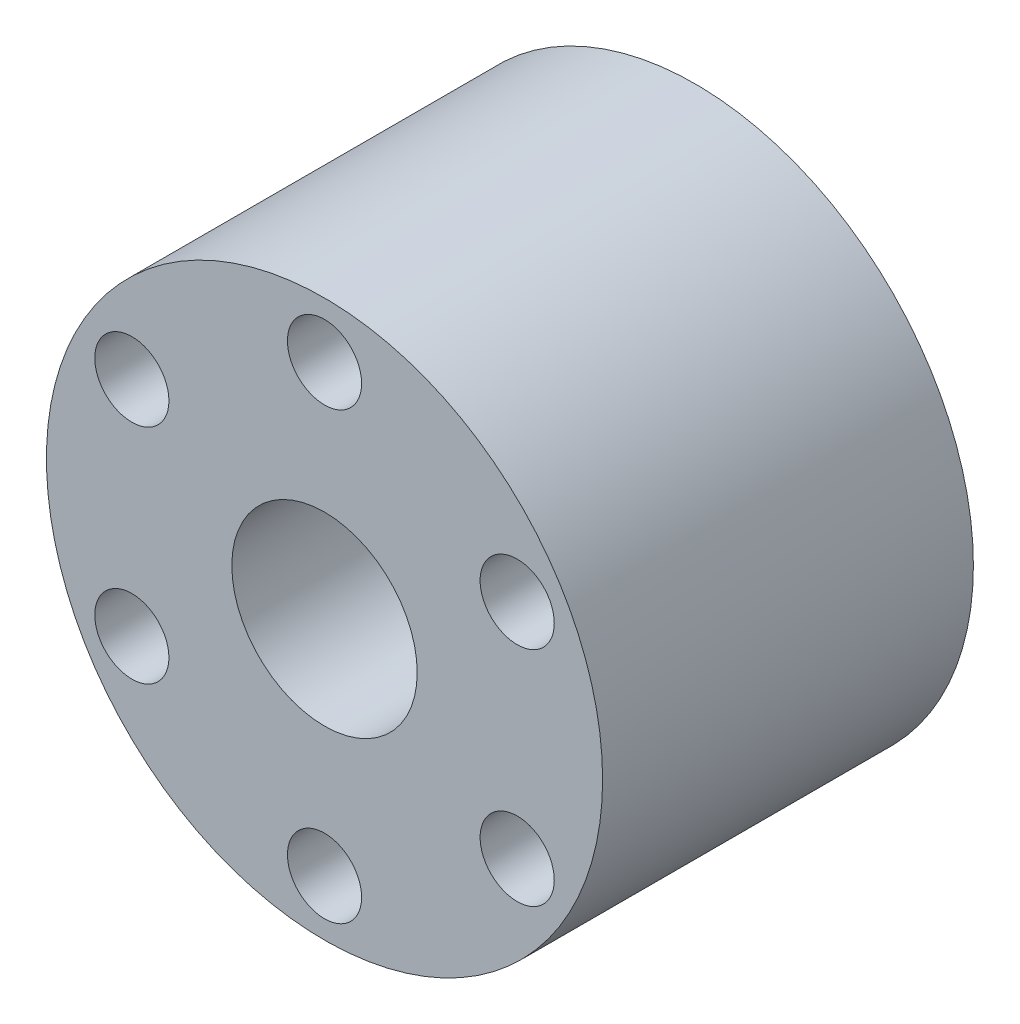
ISO-10303-21;
HEADER;
FILE_DESCRIPTION(('STEP AP214'),'2;1');
FILE_NAME('part.step','',(''),(''),'','','');
FILE_SCHEMA(('AUTOMOTIVE_DESIGN { 1 0 10303 214 1 1 1 1 }'));
ENDSEC;
DATA;
#1=APPLICATION_CONTEXT('core data for automotive mechanical design processes');
#2=APPLICATION_PROTOCOL_DEFINITION('international standard','automotive_design',2000,#1);
#3=PRODUCT_CONTEXT('',#1,'mechanical');
#4=PRODUCT('Part','Part','',(#3));
#5=PRODUCT_RELATED_PRODUCT_CATEGORY('part','',(#4));
#6=PRODUCT_DEFINITION_FORMATION('','',#4);
#7=PRODUCT_DEFINITION_CONTEXT('part definition',#1,'design');
#8=PRODUCT_DEFINITION('design','',#6,#7);
#9=PRODUCT_DEFINITION_SHAPE('','',#8);
#10=(LENGTH_UNIT() NAMED_UNIT(*) SI_UNIT(.MILLI.,.METRE.));
#11=(NAMED_UNIT(*) PLANE_ANGLE_UNIT() SI_UNIT($,.RADIAN.));
#12=(NAMED_UNIT(*) SI_UNIT($,.STERADIAN.) SOLID_ANGLE_UNIT());
#13=UNCERTAINTY_MEASURE_WITH_UNIT(LENGTH_MEASURE(1.E-05),#10,'distance_accuracy_value','');
#14=(GEOMETRIC_REPRESENTATION_CONTEXT(3) GLOBAL_UNCERTAINTY_ASSIGNED_CONTEXT((#13)) GLOBAL_UNIT_ASSIGNED_CONTEXT((#10,
#11,#12)) REPRESENTATION_CONTEXT('',''));
#15=CARTESIAN_POINT('',(0.,0.,0.));
#16=DIRECTION('',(0.,0.,1.));
#17=DIRECTION('',(1.,0.,0.));
#18=AXIS2_PLACEMENT_3D('',#15,#16,#17);
#19=CARTESIAN_POINT('',(0.,0.,20.));
#20=DIRECTION('',(0.,0.,-1.));
#21=DIRECTION('',(-1.,0.,0.));
#22=AXIS2_PLACEMENT_3D('',#19,#20,#21);
#23=CYLINDRICAL_SURFACE('',#22,15.);
#24=CARTESIAN_POINT('',(0.,0.,20.));
#25=DIRECTION('',(0.,0.,1.));
#26=DIRECTION('',(1.,0.,0.));
#27=AXIS2_PLACEMENT_3D('',#24,#25,#26);
#28=CIRCLE('',#27,15.);
#29=CARTESIAN_POINT('',(15.,0.,20.));
#30=VERTEX_POINT('',#29);
#31=EDGE_CURVE('E10',#30,#30,#28,.T.);
#32=ORIENTED_EDGE('',*,*,#31,.F.);
#33=EDGE_LOOP('',(#32));
#34=FACE_BOUND('',#33,.T.);
#35=CARTESIAN_POINT('',(0.,0.,0.));
#36=DIRECTION('',(0.,0.,1.));
#37=DIRECTION('',(1.,0.,0.));
#38=AXIS2_PLACEMENT_3D('',#35,#36,#37);
#39=CIRCLE('',#38,15.);
#40=CARTESIAN_POINT('',(15.,0.,0.));
#41=VERTEX_POINT('',#40);
#42=EDGE_CURVE('E35',#41,#41,#39,.T.);
#43=ORIENTED_EDGE('',*,*,#42,.T.);
#44=EDGE_LOOP('',(#43));
#45=FACE_BOUND('',#44,.T.);
#46=ADVANCED_FACE('F32',(#34,#45),#23,.T.);
#47=CARTESIAN_POINT('',(0.,0.,20.));
#48=DIRECTION('',(0.,0.,1.));
#49=DIRECTION('',(1.,0.,0.));
#50=AXIS2_PLACEMENT_3D('',#47,#48,#49);
#51=PLANE('',#50);
#52=CARTESIAN_POINT('',(-10.3923048454133,5.99999999999999,20.));
#53=DIRECTION('',(0.,0.,1.));
#54=DIRECTION('',(1.,0.,0.));
#55=AXIS2_PLACEMENT_3D('',#52,#53,#54);
#56=CIRCLE('',#55,2.00000000000012);
#57=CARTESIAN_POINT('',(-8.39230484541315,5.99999999999999,20.));
#58=VERTEX_POINT('',#57);
#59=EDGE_CURVE('E50',#58,#58,#56,.T.);
#60=ORIENTED_EDGE('',*,*,#59,.F.);
#61=EDGE_LOOP('',(#60));
#62=FACE_BOUND('',#61,.T.);
#63=CARTESIAN_POINT('',(-10.3923048454133,-6.00000000000001,20.));
#64=DIRECTION('',(0.,0.,1.));
#65=DIRECTION('',(1.,0.,0.));
#66=AXIS2_PLACEMENT_3D('',#63,#64,#65);
#67=CIRCLE('',#66,2.00000000000063);
#68=CARTESIAN_POINT('',(-8.39230484541263,-6.00000000000001,20.));
#69=VERTEX_POINT('',#68);
#70=EDGE_CURVE('E56',#69,#69,#67,.T.);
#71=ORIENTED_EDGE('',*,*,#70,.F.);
#72=EDGE_LOOP('',(#71));
#73=FACE_BOUND('',#72,.T.);
#74=CARTESIAN_POINT('',(0.,-12.,20.));
#75=DIRECTION('',(0.,0.,1.));
#76=DIRECTION('',(1.,0.,0.));
#77=AXIS2_PLACEMENT_3D('',#74,#75,#76);
#78=CIRCLE('',#77,2.00000000000103);
#79=CARTESIAN_POINT('',(2.00000000000103,-12.,20.));
#80=VERTEX_POINT('',#79);
#81=EDGE_CURVE('E62',#80,#80,#78,.T.);
#82=ORIENTED_EDGE('',*,*,#81,.F.);
#83=EDGE_LOOP('',(#82));
#84=FACE_BOUND('',#83,.T.);
#85=CARTESIAN_POINT('',(10.3923048454133,-6.,20.));
#86=DIRECTION('',(0.,0.,1.));
#87=DIRECTION('',(1.,0.,0.));
#88=AXIS2_PLACEMENT_3D('',#85,#86,#87);
#89=CIRCLE('',#88,2.0000000000009);
#90=CARTESIAN_POINT('',(12.3923048454142,-6.,20.));
#91=VERTEX_POINT('',#90);
#92=EDGE_CURVE('E68',#91,#91,#89,.T.);
#93=ORIENTED_EDGE('',*,*,#92,.F.);
#94=EDGE_LOOP('',(#93));
#95=FACE_BOUND('',#94,.T.);
#96=CARTESIAN_POINT('',(10.3923048454133,6.,20.));
#97=DIRECTION('',(0.,0.,1.));
#98=DIRECTION('',(1.,0.,0.));
#99=AXIS2_PLACEMENT_3D('',#96,#97,#98);
#100=CIRCLE('',#99,2.00000000000039);
#101=CARTESIAN_POINT('',(12.3923048454137,6.,20.));
#102=VERTEX_POINT('',#101);
#103=EDGE_CURVE('E74',#102,#102,#100,.T.);
#104=ORIENTED_EDGE('',*,*,#103,.F.);
#105=EDGE_LOOP('',(#104));
#106=FACE_BOUND('',#105,.T.);
#107=CARTESIAN_POINT('',(0.,12.,20.));
#108=DIRECTION('',(0.,0.,1.));
#109=DIRECTION('',(1.,0.,0.));
#110=AXIS2_PLACEMENT_3D('',#107,#108,#109);
#111=CIRCLE('',#110,2.);
#112=CARTESIAN_POINT('',(2.,12.,20.));
#113=VERTEX_POINT('',#112);
#114=EDGE_CURVE('E80',#113,#113,#111,.T.);
#115=ORIENTED_EDGE('',*,*,#114,.F.);
#116=EDGE_LOOP('',(#115));
#117=FACE_BOUND('',#116,.T.);
#118=CARTESIAN_POINT('',(0.,0.,20.));
#119=DIRECTION('',(0.,0.,1.));
#120=DIRECTION('',(1.,0.,0.));
#121=AXIS2_PLACEMENT_3D('',#118,#119,#120);
#122=CIRCLE('',#121,5.);
#123=CARTESIAN_POINT('',(5.,0.,20.));
#124=VERTEX_POINT('',#123);
#125=EDGE_CURVE('E44',#124,#124,#122,.T.);
#126=ORIENTED_EDGE('',*,*,#125,.F.);
#127=EDGE_LOOP('',(#126));
#128=FACE_BOUND('',#127,.T.);
#129=ORIENTED_EDGE('',*,*,#31,.T.);
#130=EDGE_LOOP('',(#129));
#131=FACE_BOUND('',#130,.T.);
#132=ADVANCED_FACE('F97',(#62,#73,#84,#95,#106,#117,#128,#131),#51,.T.);
#133=CARTESIAN_POINT('',(0.,0.,0.));
#134=DIRECTION('',(0.,0.,1.));
#135=DIRECTION('',(1.,0.,0.));
#136=AXIS2_PLACEMENT_3D('',#133,#134,#135);
#137=PLANE('',#136);
#138=CARTESIAN_POINT('',(-10.3923048454133,5.99999999999999,0.));
#139=DIRECTION('',(0.,0.,1.));
#140=DIRECTION('',(1.,0.,0.));
#141=AXIS2_PLACEMENT_3D('',#138,#139,#140);
#142=CIRCLE('',#141,2.00000000000012);
#143=CARTESIAN_POINT('',(-8.39230484541315,5.99999999999999,0.));
#144=VERTEX_POINT('',#143);
#145=EDGE_CURVE('E53',#144,#144,#142,.T.);
#146=ORIENTED_EDGE('',*,*,#145,.T.);
#147=EDGE_LOOP('',(#146));
#148=FACE_BOUND('',#147,.T.);
#149=CARTESIAN_POINT('',(-10.3923048454133,-6.00000000000001,0.));
#150=DIRECTION('',(0.,0.,1.));
#151=DIRECTION('',(1.,0.,0.));
#152=AXIS2_PLACEMENT_3D('',#149,#150,#151);
#153=CIRCLE('',#152,2.00000000000063);
#154=CARTESIAN_POINT('',(-8.39230484541263,-6.00000000000001,0.));
#155=VERTEX_POINT('',#154);
#156=EDGE_CURVE('E59',#155,#155,#153,.T.);
#157=ORIENTED_EDGE('',*,*,#156,.T.);
#158=EDGE_LOOP('',(#157));
#159=FACE_BOUND('',#158,.T.);
#160=CARTESIAN_POINT('',(0.,-12.,0.));
#161=DIRECTION('',(0.,0.,1.));
#162=DIRECTION('',(1.,0.,0.));
#163=AXIS2_PLACEMENT_3D('',#160,#161,#162);
#164=CIRCLE('',#163,2.00000000000103);
#165=CARTESIAN_POINT('',(2.00000000000103,-12.,0.));
#166=VERTEX_POINT('',#165);
#167=EDGE_CURVE('E65',#166,#166,#164,.T.);
#168=ORIENTED_EDGE('',*,*,#167,.T.);
#169=EDGE_LOOP('',(#168));
#170=FACE_BOUND('',#169,.T.);
#171=CARTESIAN_POINT('',(10.3923048454133,-6.,0.));
#172=DIRECTION('',(0.,0.,1.));
#173=DIRECTION('',(1.,0.,0.));
#174=AXIS2_PLACEMENT_3D('',#171,#172,#173);
#175=CIRCLE('',#174,2.0000000000009);
#176=CARTESIAN_POINT('',(12.3923048454142,-6.,0.));
#177=VERTEX_POINT('',#176);
#178=EDGE_CURVE('E71',#177,#177,#175,.T.);
#179=ORIENTED_EDGE('',*,*,#178,.T.);
#180=EDGE_LOOP('',(#179));
#181=FACE_BOUND('',#180,.T.);
#182=CARTESIAN_POINT('',(10.3923048454133,6.,0.));
#183=DIRECTION('',(0.,0.,1.));
#184=DIRECTION('',(1.,0.,0.));
#185=AXIS2_PLACEMENT_3D('',#182,#183,#184);
#186=CIRCLE('',#185,2.00000000000039);
#187=CARTESIAN_POINT('',(12.3923048454137,6.,0.));
#188=VERTEX_POINT('',#187);
#189=EDGE_CURVE('E77',#188,#188,#186,.T.);
#190=ORIENTED_EDGE('',*,*,#189,.T.);
#191=EDGE_LOOP('',(#190));
#192=FACE_BOUND('',#191,.T.);
#193=CARTESIAN_POINT('',(0.,12.,0.));
#194=DIRECTION('',(0.,0.,1.));
#195=DIRECTION('',(1.,0.,0.));
#196=AXIS2_PLACEMENT_3D('',#193,#194,#195);
#197=CIRCLE('',#196,2.);
#198=CARTESIAN_POINT('',(2.,12.,0.));
#199=VERTEX_POINT('',#198);
#200=EDGE_CURVE('E47',#199,#199,#197,.T.);
#201=ORIENTED_EDGE('',*,*,#200,.T.);
#202=EDGE_LOOP('',(#201));
#203=FACE_BOUND('',#202,.T.);
#204=CARTESIAN_POINT('',(0.,0.,0.));
#205=DIRECTION('',(0.,0.,1.));
#206=DIRECTION('',(1.,0.,0.));
#207=AXIS2_PLACEMENT_3D('',#204,#205,#206);
#208=CIRCLE('',#207,5.);
#209=CARTESIAN_POINT('',(5.,0.,0.));
#210=VERTEX_POINT('',#209);
#211=EDGE_CURVE('E42',#210,#210,#208,.T.);
#212=ORIENTED_EDGE('',*,*,#211,.T.);
#213=EDGE_LOOP('',(#212));
#214=FACE_BOUND('',#213,.T.);
#215=ORIENTED_EDGE('',*,*,#42,.F.);
#216=EDGE_LOOP('',(#215));
#217=FACE_BOUND('',#216,.T.);
#218=ADVANCED_FACE('F86',(#148,#159,#170,#181,#192,#203,#214,#217),#137,.F.);
#219=CARTESIAN_POINT('',(0.,0.,0.));
#220=DIRECTION('',(0.,0.,1.));
#221=DIRECTION('',(1.,0.,0.));
#222=AXIS2_PLACEMENT_3D('',#219,#220,#221);
#223=CYLINDRICAL_SURFACE('',#222,5.);
#224=ORIENTED_EDGE('',*,*,#211,.F.);
#225=EDGE_LOOP('',(#224));
#226=FACE_BOUND('',#225,.T.);
#227=ORIENTED_EDGE('',*,*,#125,.T.);
#228=EDGE_LOOP('',(#227));
#229=FACE_BOUND('',#228,.T.);
#230=ADVANCED_FACE('F93',(#226,#229),#223,.F.);
#231=CARTESIAN_POINT('',(0.,12.,0.));
#232=DIRECTION('',(0.,0.,1.));
#233=DIRECTION('',(1.,0.,0.));
#234=AXIS2_PLACEMENT_3D('',#231,#232,#233);
#235=CYLINDRICAL_SURFACE('',#234,2.);
#236=ORIENTED_EDGE('',*,*,#200,.F.);
#237=EDGE_LOOP('',(#236));
#238=FACE_BOUND('',#237,.T.);
#239=ORIENTED_EDGE('',*,*,#114,.T.);
#240=EDGE_LOOP('',(#239));
#241=FACE_BOUND('',#240,.T.);
#242=ADVANCED_FACE('F89',(#238,#241),#235,.F.);
#243=CARTESIAN_POINT('',(10.3923048454133,6.,0.));
#244=DIRECTION('',(0.,0.,1.));
#245=DIRECTION('',(1.,0.,0.));
#246=AXIS2_PLACEMENT_3D('',#243,#244,#245);
#247=CYLINDRICAL_SURFACE('',#246,2.00000000000039);
#248=ORIENTED_EDGE('',*,*,#189,.F.);
#249=EDGE_LOOP('',(#248));
#250=FACE_BOUND('',#249,.T.);
#251=ORIENTED_EDGE('',*,*,#103,.T.);
#252=EDGE_LOOP('',(#251));
#253=FACE_BOUND('',#252,.T.);
#254=ADVANCED_FACE('F92',(#250,#253),#247,.F.);
#255=CARTESIAN_POINT('',(10.3923048454133,-6.,0.));
#256=DIRECTION('',(0.,0.,1.));
#257=DIRECTION('',(1.,0.,0.));
#258=AXIS2_PLACEMENT_3D('',#255,#256,#257);
#259=CYLINDRICAL_SURFACE('',#258,2.0000000000009);
#260=ORIENTED_EDGE('',*,*,#178,.F.);
#261=EDGE_LOOP('',(#260));
#262=FACE_BOUND('',#261,.T.);
#263=ORIENTED_EDGE('',*,*,#92,.T.);
#264=EDGE_LOOP('',(#263));
#265=FACE_BOUND('',#264,.T.);
#266=ADVANCED_FACE('F147',(#262,#265),#259,.F.);
#267=CARTESIAN_POINT('',(0.,-12.,0.));
#268=DIRECTION('',(0.,0.,1.));
#269=DIRECTION('',(1.,0.,0.));
#270=AXIS2_PLACEMENT_3D('',#267,#268,#269);
#271=CYLINDRICAL_SURFACE('',#270,2.00000000000103);
#272=ORIENTED_EDGE('',*,*,#167,.F.);
#273=EDGE_LOOP('',(#272));
#274=FACE_BOUND('',#273,.T.);
#275=ORIENTED_EDGE('',*,*,#81,.T.);
#276=EDGE_LOOP('',(#275));
#277=FACE_BOUND('',#276,.T.);
#278=ADVANCED_FACE('F157',(#274,#277),#271,.F.);
#279=CARTESIAN_POINT('',(-10.3923048454133,-6.00000000000001,0.));
#280=DIRECTION('',(0.,0.,1.));
#281=DIRECTION('',(1.,0.,0.));
#282=AXIS2_PLACEMENT_3D('',#279,#280,#281);
#283=CYLINDRICAL_SURFACE('',#282,2.00000000000063);
#284=ORIENTED_EDGE('',*,*,#156,.F.);
#285=EDGE_LOOP('',(#284));
#286=FACE_BOUND('',#285,.T.);
#287=ORIENTED_EDGE('',*,*,#70,.T.);
#288=EDGE_LOOP('',(#287));
#289=FACE_BOUND('',#288,.T.);
#290=ADVANCED_FACE('F167',(#286,#289),#283,.F.);
#291=CARTESIAN_POINT('',(-10.3923048454133,5.99999999999999,0.));
#292=DIRECTION('',(0.,0.,1.));
#293=DIRECTION('',(1.,0.,0.));
#294=AXIS2_PLACEMENT_3D('',#291,#292,#293);
#295=CYLINDRICAL_SURFACE('',#294,2.00000000000012);
#296=ORIENTED_EDGE('',*,*,#145,.F.);
#297=EDGE_LOOP('',(#296));
#298=FACE_BOUND('',#297,.T.);
#299=ORIENTED_EDGE('',*,*,#59,.T.);
#300=EDGE_LOOP('',(#299));
#301=FACE_BOUND('',#300,.T.);
#302=ADVANCED_FACE('F177',(#298,#301),#295,.F.);
#303=CLOSED_SHELL('',(#46,#132,#218,#230,#242,#254,#266,#278,#290,#302));
#304=MANIFOLD_SOLID_BREP('B2',#303);
#305=ADVANCED_BREP_SHAPE_REPRESENTATION('',(#18,#304),#14);
#306=SHAPE_DEFINITION_REPRESENTATION(#9,#305);
ENDSEC;
END-ISO-10303-21;
